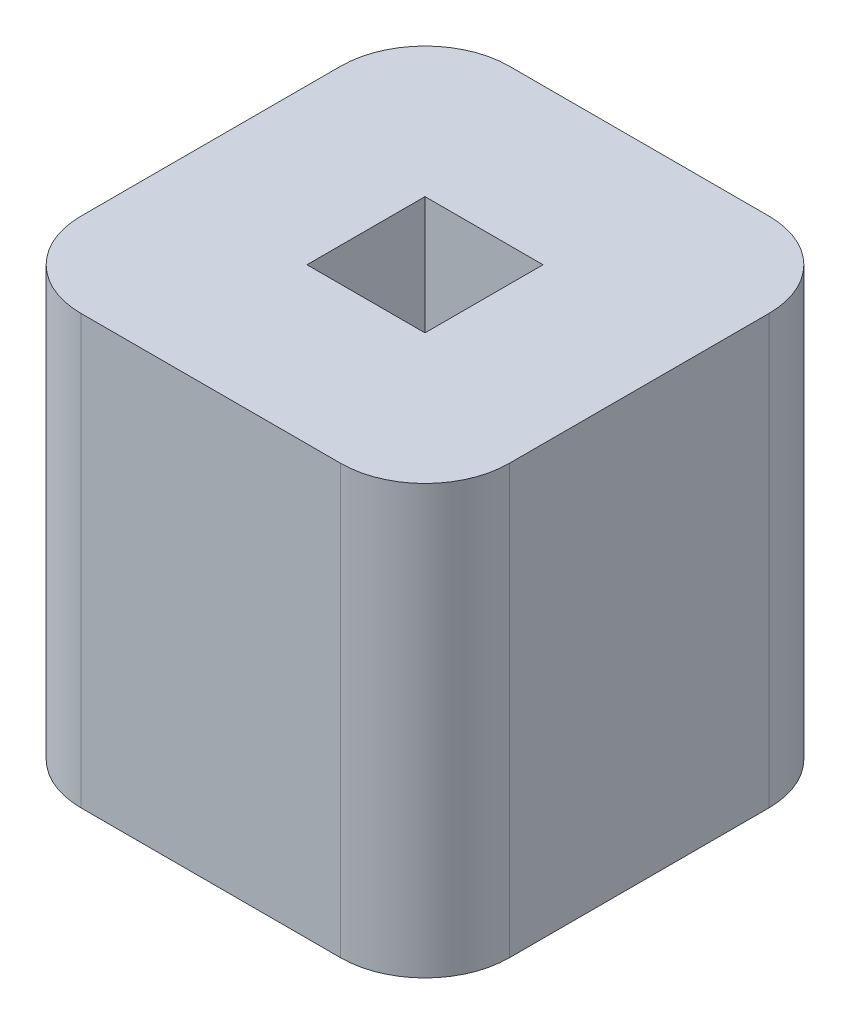
ISO-10303-21;
HEADER;
FILE_DESCRIPTION(('STEP AP214'),'2;1');
FILE_NAME('part.step','',(''),(''),'','','');
FILE_SCHEMA(('AUTOMOTIVE_DESIGN { 1 0 10303 214 1 1 1 1 }'));
ENDSEC;
DATA;
#1=APPLICATION_CONTEXT('core data for automotive mechanical design processes');
#2=APPLICATION_PROTOCOL_DEFINITION('international standard','automotive_design',2000,#1);
#3=PRODUCT_CONTEXT('',#1,'mechanical');
#4=PRODUCT('Part','Part','',(#3));
#5=PRODUCT_RELATED_PRODUCT_CATEGORY('part','',(#4));
#6=PRODUCT_DEFINITION_FORMATION('','',#4);
#7=PRODUCT_DEFINITION_CONTEXT('part definition',#1,'design');
#8=PRODUCT_DEFINITION('design','',#6,#7);
#9=PRODUCT_DEFINITION_SHAPE('','',#8);
#10=(LENGTH_UNIT() NAMED_UNIT(*) SI_UNIT(.MILLI.,.METRE.));
#11=(NAMED_UNIT(*) PLANE_ANGLE_UNIT() SI_UNIT($,.RADIAN.));
#12=(NAMED_UNIT(*) SI_UNIT($,.STERADIAN.) SOLID_ANGLE_UNIT());
#13=UNCERTAINTY_MEASURE_WITH_UNIT(LENGTH_MEASURE(1.E-05),#10,'distance_accuracy_value','');
#14=(GEOMETRIC_REPRESENTATION_CONTEXT(3) GLOBAL_UNCERTAINTY_ASSIGNED_CONTEXT((#13)) GLOBAL_UNIT_ASSIGNED_CONTEXT((#10,
#11,#12)) REPRESENTATION_CONTEXT('',''));
#15=CARTESIAN_POINT('',(0.,0.,0.));
#16=DIRECTION('',(0.,0.,1.));
#17=DIRECTION('',(1.,0.,0.));
#18=AXIS2_PLACEMENT_3D('',#15,#16,#17);
#19=CARTESIAN_POINT('',(-1.27,2.54,1.27));
#20=DIRECTION('',(0.,0.,-1.));
#21=DIRECTION('',(-1.,0.,0.));
#22=AXIS2_PLACEMENT_3D('',#19,#20,#21);
#23=PLANE('',#22);
#24=DIRECTION('',(0.,-1.,0.));
#25=VECTOR('',#24,1.);
#26=CARTESIAN_POINT('',(-0.77,2.54,1.27));
#27=LINE('',#26,#25);
#28=CARTESIAN_POINT('',(-0.77,0.,1.27));
#29=VERTEX_POINT('',#28);
#30=CARTESIAN_POINT('',(-0.77,2.54,1.27));
#31=VERTEX_POINT('',#30);
#32=EDGE_CURVE('E118',#29,#31,#27,.F.);
#33=ORIENTED_EDGE('',*,*,#32,.F.);
#34=DIRECTION('',(-1.,0.,0.));
#35=VECTOR('',#34,1.);
#36=CARTESIAN_POINT('',(-1.27,0.,1.27));
#37=LINE('',#36,#35);
#38=CARTESIAN_POINT('',(0.77,0.,1.27));
#39=VERTEX_POINT('',#38);
#40=EDGE_CURVE('E124',#39,#29,#37,.T.);
#41=ORIENTED_EDGE('',*,*,#40,.F.);
#42=DIRECTION('',(0.,-1.,0.));
#43=VECTOR('',#42,1.);
#44=CARTESIAN_POINT('',(0.77,2.54,1.27));
#45=LINE('',#44,#43);
#46=CARTESIAN_POINT('',(0.77,2.54,1.27));
#47=VERTEX_POINT('',#46);
#48=EDGE_CURVE('E121',#47,#39,#45,.T.);
#49=ORIENTED_EDGE('',*,*,#48,.F.);
#50=DIRECTION('',(-1.,0.,0.));
#51=VECTOR('',#50,1.);
#52=CARTESIAN_POINT('',(-1.27,2.54,1.27));
#53=LINE('',#52,#51);
#54=EDGE_CURVE('E106',#31,#47,#53,.F.);
#55=ORIENTED_EDGE('',*,*,#54,.F.);
#56=EDGE_LOOP('',(#33,#41,#49,#55));
#57=FACE_BOUND('',#56,.T.);
#58=ADVANCED_FACE('F17',(#57),#23,.F.);
#59=CARTESIAN_POINT('',(-0.77,2.54,0.77));
#60=DIRECTION('',(0.,-1.,0.));
#61=DIRECTION('',(0.,0.,-1.));
#62=AXIS2_PLACEMENT_3D('',#59,#60,#61);
#63=CYLINDRICAL_SURFACE('',#62,0.5);
#64=CARTESIAN_POINT('',(-0.77,0.,0.77));
#65=DIRECTION('',(0.,-1.,0.));
#66=DIRECTION('',(0.,0.,-1.));
#67=AXIS2_PLACEMENT_3D('',#64,#65,#66);
#68=CIRCLE('',#67,0.5);
#69=CARTESIAN_POINT('',(-1.27,0.,0.77));
#70=VERTEX_POINT('',#69);
#71=EDGE_CURVE('E115',#70,#29,#68,.F.);
#72=ORIENTED_EDGE('',*,*,#71,.T.);
#73=ORIENTED_EDGE('',*,*,#32,.T.);
#74=CARTESIAN_POINT('',(-0.77,2.54,0.77));
#75=DIRECTION('',(0.,-1.,0.));
#76=DIRECTION('',(0.,0.,-1.));
#77=AXIS2_PLACEMENT_3D('',#74,#75,#76);
#78=CIRCLE('',#77,0.5);
#79=CARTESIAN_POINT('',(-1.27,2.54,0.77));
#80=VERTEX_POINT('',#79);
#81=EDGE_CURVE('E20',#31,#80,#78,.T.);
#82=ORIENTED_EDGE('',*,*,#81,.T.);
#83=DIRECTION('',(0.,1.,0.));
#84=VECTOR('',#83,1.);
#85=CARTESIAN_POINT('',(-1.27,2.54,0.77));
#86=LINE('',#85,#84);
#87=EDGE_CURVE('E164',#80,#70,#86,.F.);
#88=ORIENTED_EDGE('',*,*,#87,.T.);
#89=EDGE_LOOP('',(#72,#73,#82,#88));
#90=FACE_BOUND('',#89,.T.);
#91=ADVANCED_FACE('F126',(#90),#63,.T.);
#92=CARTESIAN_POINT('',(0.77,2.54,0.77));
#93=DIRECTION('',(0.,-1.,0.));
#94=DIRECTION('',(0.,0.,-1.));
#95=AXIS2_PLACEMENT_3D('',#92,#93,#94);
#96=CYLINDRICAL_SURFACE('',#95,0.5);
#97=CARTESIAN_POINT('',(0.77,0.,0.77));
#98=DIRECTION('',(0.,-1.,0.));
#99=DIRECTION('',(0.,0.,-1.));
#100=AXIS2_PLACEMENT_3D('',#97,#98,#99);
#101=CIRCLE('',#100,0.5);
#102=CARTESIAN_POINT('',(1.27,0.,0.77));
#103=VERTEX_POINT('',#102);
#104=EDGE_CURVE('E155',#39,#103,#101,.F.);
#105=ORIENTED_EDGE('',*,*,#104,.T.);
#106=DIRECTION('',(0.,1.,0.));
#107=VECTOR('',#106,1.);
#108=CARTESIAN_POINT('',(1.27,2.54,0.77));
#109=LINE('',#108,#107);
#110=CARTESIAN_POINT('',(1.27,2.54,0.77));
#111=VERTEX_POINT('',#110);
#112=EDGE_CURVE('E186',#103,#111,#109,.T.);
#113=ORIENTED_EDGE('',*,*,#112,.T.);
#114=CARTESIAN_POINT('',(0.77,2.54,0.77));
#115=DIRECTION('',(0.,-1.,0.));
#116=DIRECTION('',(0.,0.,-1.));
#117=AXIS2_PLACEMENT_3D('',#114,#115,#116);
#118=CIRCLE('',#117,0.5);
#119=EDGE_CURVE('E128',#111,#47,#118,.T.);
#120=ORIENTED_EDGE('',*,*,#119,.T.);
#121=ORIENTED_EDGE('',*,*,#48,.T.);
#122=EDGE_LOOP('',(#105,#113,#120,#121));
#123=FACE_BOUND('',#122,.T.);
#124=ADVANCED_FACE('F260',(#123),#96,.T.);
#125=CARTESIAN_POINT('',(-1.27,2.54,-1.27));
#126=DIRECTION('',(1.,0.,0.));
#127=DIRECTION('',(0.,0.,-1.));
#128=AXIS2_PLACEMENT_3D('',#125,#126,#127);
#129=PLANE('',#128);
#130=ORIENTED_EDGE('',*,*,#87,.F.);
#131=DIRECTION('',(0.,0.,-1.));
#132=VECTOR('',#131,1.);
#133=CARTESIAN_POINT('',(-1.27,2.54,-1.27));
#134=LINE('',#133,#132);
#135=CARTESIAN_POINT('',(-1.27,2.54,-0.77));
#136=VERTEX_POINT('',#135);
#137=EDGE_CURVE('E109',#136,#80,#134,.F.);
#138=ORIENTED_EDGE('',*,*,#137,.F.);
#139=DIRECTION('',(0.,-1.,0.));
#140=VECTOR('',#139,1.);
#141=CARTESIAN_POINT('',(-1.27,2.54,-0.77));
#142=LINE('',#141,#140);
#143=CARTESIAN_POINT('',(-1.27,0.,-0.77));
#144=VERTEX_POINT('',#143);
#145=EDGE_CURVE('E150',#144,#136,#142,.F.);
#146=ORIENTED_EDGE('',*,*,#145,.F.);
#147=DIRECTION('',(0.,0.,-1.));
#148=VECTOR('',#147,1.);
#149=CARTESIAN_POINT('',(-1.27,0.,-1.27));
#150=LINE('',#149,#148);
#151=EDGE_CURVE('E189',#70,#144,#150,.T.);
#152=ORIENTED_EDGE('',*,*,#151,.F.);
#153=EDGE_LOOP('',(#130,#138,#146,#152));
#154=FACE_BOUND('',#153,.T.);
#155=ADVANCED_FACE('F255',(#154),#129,.F.);
#156=CARTESIAN_POINT('',(1.27,2.54,-1.27));
#157=DIRECTION('',(-1.,0.,0.));
#158=DIRECTION('',(0.,0.,1.));
#159=AXIS2_PLACEMENT_3D('',#156,#157,#158);
#160=PLANE('',#159);
#161=DIRECTION('',(0.,-1.,0.));
#162=VECTOR('',#161,1.);
#163=CARTESIAN_POINT('',(1.27,2.54,-0.77));
#164=LINE('',#163,#162);
#165=CARTESIAN_POINT('',(1.27,2.54,-0.77));
#166=VERTEX_POINT('',#165);
#167=CARTESIAN_POINT('',(1.27,0.,-0.77));
#168=VERTEX_POINT('',#167);
#169=EDGE_CURVE('E145',#166,#168,#164,.T.);
#170=ORIENTED_EDGE('',*,*,#169,.F.);
#171=DIRECTION('',(0.,0.,1.));
#172=VECTOR('',#171,1.);
#173=CARTESIAN_POINT('',(1.27,2.54,-1.27));
#174=LINE('',#173,#172);
#175=EDGE_CURVE('E183',#111,#166,#174,.F.);
#176=ORIENTED_EDGE('',*,*,#175,.F.);
#177=ORIENTED_EDGE('',*,*,#112,.F.);
#178=DIRECTION('',(0.,0.,1.));
#179=VECTOR('',#178,1.);
#180=CARTESIAN_POINT('',(1.27,0.,-1.27));
#181=LINE('',#180,#179);
#182=EDGE_CURVE('E176',#168,#103,#181,.T.);
#183=ORIENTED_EDGE('',*,*,#182,.F.);
#184=EDGE_LOOP('',(#170,#176,#177,#183));
#185=FACE_BOUND('',#184,.T.);
#186=ADVANCED_FACE('F187',(#185),#160,.F.);
#187=CARTESIAN_POINT('',(-0.35,2.54,-0.35));
#188=DIRECTION('',(1.,0.,0.));
#189=DIRECTION('',(0.,0.,-1.));
#190=AXIS2_PLACEMENT_3D('',#187,#188,#189);
#191=PLANE('',#190);
#192=DIRECTION('',(0.,0.,-1.));
#193=VECTOR('',#192,1.);
#194=CARTESIAN_POINT('',(-0.35,2.54,-0.35));
#195=LINE('',#194,#193);
#196=CARTESIAN_POINT('',(-0.35,2.54,-0.35));
#197=VERTEX_POINT('',#196);
#198=CARTESIAN_POINT('',(-0.35,2.54,0.35));
#199=VERTEX_POINT('',#198);
#200=EDGE_CURVE('E154',#197,#199,#195,.F.);
#201=ORIENTED_EDGE('',*,*,#200,.T.);
#202=DIRECTION('',(0.,1.,0.));
#203=VECTOR('',#202,1.);
#204=CARTESIAN_POINT('',(-0.35,2.54,0.35));
#205=LINE('',#204,#203);
#206=CARTESIAN_POINT('',(-0.35,0.,0.35));
#207=VERTEX_POINT('',#206);
#208=EDGE_CURVE('E211',#207,#199,#205,.T.);
#209=ORIENTED_EDGE('',*,*,#208,.F.);
#210=DIRECTION('',(0.,0.,1.));
#211=VECTOR('',#210,1.);
#212=CARTESIAN_POINT('',(-0.35,0.,0.));
#213=LINE('',#212,#211);
#214=CARTESIAN_POINT('',(-0.35,0.,-0.35));
#215=VERTEX_POINT('',#214);
#216=EDGE_CURVE('E141',#207,#215,#213,.F.);
#217=ORIENTED_EDGE('',*,*,#216,.T.);
#218=DIRECTION('',(0.,1.,0.));
#219=VECTOR('',#218,1.);
#220=CARTESIAN_POINT('',(-0.35,2.54,-0.35));
#221=LINE('',#220,#219);
#222=EDGE_CURVE('E222',#197,#215,#221,.F.);
#223=ORIENTED_EDGE('',*,*,#222,.F.);
#224=EDGE_LOOP('',(#201,#209,#217,#223));
#225=FACE_BOUND('',#224,.T.);
#226=ADVANCED_FACE('F267',(#225),#191,.T.);
#227=CARTESIAN_POINT('',(-0.77,2.54,-0.77));
#228=DIRECTION('',(0.,-1.,0.));
#229=DIRECTION('',(0.,0.,-1.));
#230=AXIS2_PLACEMENT_3D('',#227,#228,#229);
#231=CYLINDRICAL_SURFACE('',#230,0.5);
#232=CARTESIAN_POINT('',(-0.77,0.,-0.77));
#233=DIRECTION('',(0.,-1.,0.));
#234=DIRECTION('',(0.,0.,-1.));
#235=AXIS2_PLACEMENT_3D('',#232,#233,#234);
#236=CIRCLE('',#235,0.5);
#237=CARTESIAN_POINT('',(-0.77,0.,-1.27));
#238=VERTEX_POINT('',#237);
#239=EDGE_CURVE('E137',#238,#144,#236,.F.);
#240=ORIENTED_EDGE('',*,*,#239,.T.);
#241=ORIENTED_EDGE('',*,*,#145,.T.);
#242=CARTESIAN_POINT('',(-0.77,2.54,-0.77));
#243=DIRECTION('',(0.,-1.,0.));
#244=DIRECTION('',(0.,0.,-1.));
#245=AXIS2_PLACEMENT_3D('',#242,#243,#244);
#246=CIRCLE('',#245,0.5);
#247=CARTESIAN_POINT('',(-0.77,2.54,-1.27));
#248=VERTEX_POINT('',#247);
#249=EDGE_CURVE('E151',#136,#248,#246,.T.);
#250=ORIENTED_EDGE('',*,*,#249,.T.);
#251=DIRECTION('',(0.,1.,0.));
#252=VECTOR('',#251,1.);
#253=CARTESIAN_POINT('',(-0.77,2.54,-1.27));
#254=LINE('',#253,#252);
#255=EDGE_CURVE('E204',#248,#238,#254,.F.);
#256=ORIENTED_EDGE('',*,*,#255,.T.);
#257=EDGE_LOOP('',(#240,#241,#250,#256));
#258=FACE_BOUND('',#257,.T.);
#259=ADVANCED_FACE('F251',(#258),#231,.T.);
#260=CARTESIAN_POINT('',(0.77,2.54,-0.77));
#261=DIRECTION('',(0.,-1.,0.));
#262=DIRECTION('',(0.,0.,-1.));
#263=AXIS2_PLACEMENT_3D('',#260,#261,#262);
#264=CYLINDRICAL_SURFACE('',#263,0.5);
#265=CARTESIAN_POINT('',(0.77,0.,-0.77));
#266=DIRECTION('',(0.,-1.,0.));
#267=DIRECTION('',(0.,0.,-1.));
#268=AXIS2_PLACEMENT_3D('',#265,#266,#267);
#269=CIRCLE('',#268,0.5);
#270=CARTESIAN_POINT('',(0.77,0.,-1.27));
#271=VERTEX_POINT('',#270);
#272=EDGE_CURVE('E142',#168,#271,#269,.F.);
#273=ORIENTED_EDGE('',*,*,#272,.T.);
#274=DIRECTION('',(0.,1.,0.));
#275=VECTOR('',#274,1.);
#276=CARTESIAN_POINT('',(0.77,2.54,-1.27));
#277=LINE('',#276,#275);
#278=CARTESIAN_POINT('',(0.77,2.54,-1.27));
#279=VERTEX_POINT('',#278);
#280=EDGE_CURVE('E203',#271,#279,#277,.T.);
#281=ORIENTED_EDGE('',*,*,#280,.T.);
#282=CARTESIAN_POINT('',(0.77,2.54,-0.77));
#283=DIRECTION('',(0.,-1.,0.));
#284=DIRECTION('',(0.,0.,-1.));
#285=AXIS2_PLACEMENT_3D('',#282,#283,#284);
#286=CIRCLE('',#285,0.5);
#287=EDGE_CURVE('E146',#279,#166,#286,.T.);
#288=ORIENTED_EDGE('',*,*,#287,.T.);
#289=ORIENTED_EDGE('',*,*,#169,.T.);
#290=EDGE_LOOP('',(#273,#281,#288,#289));
#291=FACE_BOUND('',#290,.T.);
#292=ADVANCED_FACE('F291',(#291),#264,.T.);
#293=CARTESIAN_POINT('',(0.,0.,0.));
#294=DIRECTION('',(0.,1.,0.));
#295=DIRECTION('',(0.,0.,1.));
#296=AXIS2_PLACEMENT_3D('',#293,#294,#295);
#297=PLANE('',#296);
#298=DIRECTION('',(-1.,0.,0.));
#299=VECTOR('',#298,1.);
#300=CARTESIAN_POINT('',(-0.35,0.,0.35));
#301=LINE('',#300,#299);
#302=CARTESIAN_POINT('',(0.35,0.,0.35));
#303=VERTEX_POINT('',#302);
#304=EDGE_CURVE('E207',#303,#207,#301,.T.);
#305=ORIENTED_EDGE('',*,*,#304,.F.);
#306=DIRECTION('',(0.,0.,1.));
#307=VECTOR('',#306,1.);
#308=CARTESIAN_POINT('',(0.35,0.,-0.35));
#309=LINE('',#308,#307);
#310=CARTESIAN_POINT('',(0.35,0.,-0.35));
#311=VERTEX_POINT('',#310);
#312=EDGE_CURVE('E231',#311,#303,#309,.T.);
#313=ORIENTED_EDGE('',*,*,#312,.F.);
#314=DIRECTION('',(1.,0.,0.));
#315=VECTOR('',#314,1.);
#316=CARTESIAN_POINT('',(-0.35,0.,-0.35));
#317=LINE('',#316,#315);
#318=EDGE_CURVE('E217',#215,#311,#317,.T.);
#319=ORIENTED_EDGE('',*,*,#318,.F.);
#320=ORIENTED_EDGE('',*,*,#216,.F.);
#321=EDGE_LOOP('',(#305,#313,#319,#320));
#322=FACE_BOUND('',#321,.T.);
#323=ORIENTED_EDGE('',*,*,#71,.F.);
#324=ORIENTED_EDGE('',*,*,#151,.T.);
#325=ORIENTED_EDGE('',*,*,#239,.F.);
#326=DIRECTION('',(1.,0.,0.));
#327=VECTOR('',#326,1.);
#328=CARTESIAN_POINT('',(-1.27,0.,-1.27));
#329=LINE('',#328,#327);
#330=EDGE_CURVE('E201',#238,#271,#329,.T.);
#331=ORIENTED_EDGE('',*,*,#330,.T.);
#332=ORIENTED_EDGE('',*,*,#272,.F.);
#333=ORIENTED_EDGE('',*,*,#182,.T.);
#334=ORIENTED_EDGE('',*,*,#104,.F.);
#335=ORIENTED_EDGE('',*,*,#40,.T.);
#336=EDGE_LOOP('',(#323,#324,#325,#331,#332,#333,#334,#335));
#337=FACE_BOUND('',#336,.T.);
#338=ADVANCED_FACE('F174',(#322,#337),#297,.F.);
#339=CARTESIAN_POINT('',(-0.35,2.54,0.35));
#340=DIRECTION('',(0.,0.,-1.));
#341=DIRECTION('',(-1.,0.,0.));
#342=AXIS2_PLACEMENT_3D('',#339,#340,#341);
#343=PLANE('',#342);
#344=DIRECTION('',(-1.,0.,0.));
#345=VECTOR('',#344,1.);
#346=CARTESIAN_POINT('',(-0.35,2.54,0.35));
#347=LINE('',#346,#345);
#348=CARTESIAN_POINT('',(0.35,2.54,0.35));
#349=VERTEX_POINT('',#348);
#350=EDGE_CURVE('E215',#199,#349,#347,.F.);
#351=ORIENTED_EDGE('',*,*,#350,.T.);
#352=DIRECTION('',(0.,1.,0.));
#353=VECTOR('',#352,1.);
#354=CARTESIAN_POINT('',(0.35,2.54,0.35));
#355=LINE('',#354,#353);
#356=EDGE_CURVE('E234',#303,#349,#355,.T.);
#357=ORIENTED_EDGE('',*,*,#356,.F.);
#358=ORIENTED_EDGE('',*,*,#304,.T.);
#359=ORIENTED_EDGE('',*,*,#208,.T.);
#360=EDGE_LOOP('',(#351,#357,#358,#359));
#361=FACE_BOUND('',#360,.T.);
#362=ADVANCED_FACE('F284',(#361),#343,.T.);
#363=CARTESIAN_POINT('',(-0.35,2.54,-0.35));
#364=DIRECTION('',(0.,0.,1.));
#365=DIRECTION('',(1.,0.,0.));
#366=AXIS2_PLACEMENT_3D('',#363,#364,#365);
#367=PLANE('',#366);
#368=DIRECTION('',(1.,0.,0.));
#369=VECTOR('',#368,1.);
#370=CARTESIAN_POINT('',(-0.35,2.54,-0.35));
#371=LINE('',#370,#369);
#372=CARTESIAN_POINT('',(0.35,2.54,-0.35));
#373=VERTEX_POINT('',#372);
#374=EDGE_CURVE('E35',#373,#197,#371,.F.);
#375=ORIENTED_EDGE('',*,*,#374,.T.);
#376=ORIENTED_EDGE('',*,*,#222,.T.);
#377=ORIENTED_EDGE('',*,*,#318,.T.);
#378=DIRECTION('',(0.,1.,0.));
#379=VECTOR('',#378,1.);
#380=CARTESIAN_POINT('',(0.35,2.54,-0.35));
#381=LINE('',#380,#379);
#382=EDGE_CURVE('E238',#373,#311,#381,.F.);
#383=ORIENTED_EDGE('',*,*,#382,.F.);
#384=EDGE_LOOP('',(#375,#376,#377,#383));
#385=FACE_BOUND('',#384,.T.);
#386=ADVANCED_FACE('F281',(#385),#367,.T.);
#387=CARTESIAN_POINT('',(-1.27,2.54,-1.27));
#388=DIRECTION('',(0.,0.,1.));
#389=DIRECTION('',(1.,0.,0.));
#390=AXIS2_PLACEMENT_3D('',#387,#388,#389);
#391=PLANE('',#390);
#392=ORIENTED_EDGE('',*,*,#280,.F.);
#393=ORIENTED_EDGE('',*,*,#330,.F.);
#394=ORIENTED_EDGE('',*,*,#255,.F.);
#395=DIRECTION('',(1.,0.,0.));
#396=VECTOR('',#395,1.);
#397=CARTESIAN_POINT('',(0.,2.54,-1.27));
#398=LINE('',#397,#396);
#399=EDGE_CURVE('E27',#279,#248,#398,.F.);
#400=ORIENTED_EDGE('',*,*,#399,.F.);
#401=EDGE_LOOP('',(#392,#393,#394,#400));
#402=FACE_BOUND('',#401,.T.);
#403=ADVANCED_FACE('F247',(#402),#391,.F.);
#404=CARTESIAN_POINT('',(0.35,2.54,-0.35));
#405=DIRECTION('',(-1.,0.,0.));
#406=DIRECTION('',(0.,0.,1.));
#407=AXIS2_PLACEMENT_3D('',#404,#405,#406);
#408=PLANE('',#407);
#409=DIRECTION('',(0.,0.,1.));
#410=VECTOR('',#409,1.);
#411=CARTESIAN_POINT('',(0.35,2.54,0.));
#412=LINE('',#411,#410);
#413=EDGE_CURVE('E11',#373,#349,#412,.T.);
#414=ORIENTED_EDGE('',*,*,#413,.F.);
#415=ORIENTED_EDGE('',*,*,#382,.T.);
#416=ORIENTED_EDGE('',*,*,#312,.T.);
#417=ORIENTED_EDGE('',*,*,#356,.T.);
#418=EDGE_LOOP('',(#414,#415,#416,#417));
#419=FACE_BOUND('',#418,.T.);
#420=ADVANCED_FACE('F271',(#419),#408,.T.);
#421=CARTESIAN_POINT('',(0.,2.54,0.));
#422=DIRECTION('',(0.,1.,0.));
#423=DIRECTION('',(0.,0.,1.));
#424=AXIS2_PLACEMENT_3D('',#421,#422,#423);
#425=PLANE('',#424);
#426=ORIENTED_EDGE('',*,*,#374,.F.);
#427=ORIENTED_EDGE('',*,*,#413,.T.);
#428=ORIENTED_EDGE('',*,*,#350,.F.);
#429=ORIENTED_EDGE('',*,*,#200,.F.);
#430=EDGE_LOOP('',(#426,#427,#428,#429));
#431=FACE_BOUND('',#430,.T.);
#432=ORIENTED_EDGE('',*,*,#399,.T.);
#433=ORIENTED_EDGE('',*,*,#249,.F.);
#434=ORIENTED_EDGE('',*,*,#137,.T.);
#435=ORIENTED_EDGE('',*,*,#81,.F.);
#436=ORIENTED_EDGE('',*,*,#54,.T.);
#437=ORIENTED_EDGE('',*,*,#119,.F.);
#438=ORIENTED_EDGE('',*,*,#175,.T.);
#439=ORIENTED_EDGE('',*,*,#287,.F.);
#440=EDGE_LOOP('',(#432,#433,#434,#435,#436,#437,#438,#439));
#441=FACE_BOUND('',#440,.T.);
#442=ADVANCED_FACE('F105',(#431,#441),#425,.T.);
#443=CLOSED_SHELL('',(#58,#91,#124,#155,#186,#226,#259,#292,#338,#362,#386,#403,#420,#442));
#444=MANIFOLD_SOLID_BREP('B1',#443);
#445=ADVANCED_BREP_SHAPE_REPRESENTATION('',(#18,#444),#14);
#446=SHAPE_DEFINITION_REPRESENTATION(#9,#445);
ENDSEC;
END-ISO-10303-21;
